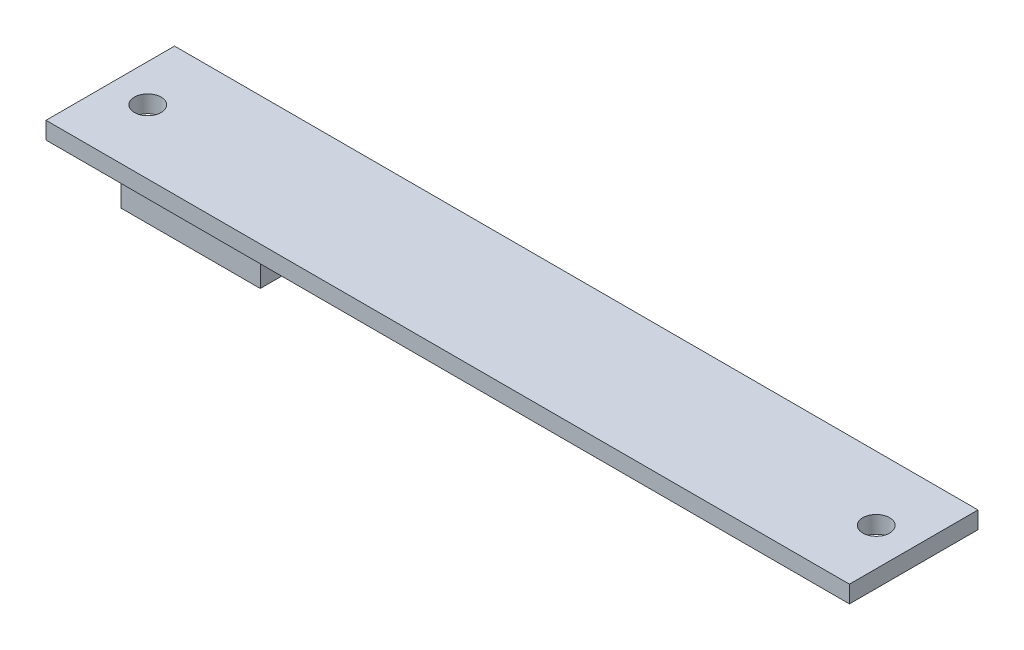
ISO-10303-21;
HEADER;
FILE_DESCRIPTION(('STEP AP214'),'2;1');
FILE_NAME('part.step','',(''),(''),'','','');
FILE_SCHEMA(('AUTOMOTIVE_DESIGN { 1 0 10303 214 1 1 1 1 }'));
ENDSEC;
DATA;
#1=APPLICATION_CONTEXT('core data for automotive mechanical design processes');
#2=APPLICATION_PROTOCOL_DEFINITION('international standard','automotive_design',2000,#1);
#3=PRODUCT_CONTEXT('',#1,'mechanical');
#4=PRODUCT('Part','Part','',(#3));
#5=PRODUCT_RELATED_PRODUCT_CATEGORY('part','',(#4));
#6=PRODUCT_DEFINITION_FORMATION('','',#4);
#7=PRODUCT_DEFINITION_CONTEXT('part definition',#1,'design');
#8=PRODUCT_DEFINITION('design','',#6,#7);
#9=PRODUCT_DEFINITION_SHAPE('','',#8);
#10=(LENGTH_UNIT() NAMED_UNIT(*) SI_UNIT(.MILLI.,.METRE.));
#11=(NAMED_UNIT(*) PLANE_ANGLE_UNIT() SI_UNIT($,.RADIAN.));
#12=(NAMED_UNIT(*) SI_UNIT($,.STERADIAN.) SOLID_ANGLE_UNIT());
#13=UNCERTAINTY_MEASURE_WITH_UNIT(LENGTH_MEASURE(1.E-05),#10,'distance_accuracy_value','');
#14=(GEOMETRIC_REPRESENTATION_CONTEXT(3) GLOBAL_UNCERTAINTY_ASSIGNED_CONTEXT((#13)) GLOBAL_UNIT_ASSIGNED_CONTEXT((#10,
#11,#12)) REPRESENTATION_CONTEXT('',''));
#15=CARTESIAN_POINT('',(0.,0.,0.));
#16=DIRECTION('',(0.,0.,1.));
#17=DIRECTION('',(1.,0.,0.));
#18=AXIS2_PLACEMENT_3D('',#15,#16,#17);
#19=CARTESIAN_POINT('',(0.,0.,0.));
#20=DIRECTION('',(0.,1.,0.));
#21=DIRECTION('',(0.,0.,1.));
#22=AXIS2_PLACEMENT_3D('',#19,#20,#21);
#23=PLANE('',#22);
#24=DIRECTION('',(0.,0.,-1.));
#25=VECTOR('',#24,1.);
#26=CARTESIAN_POINT('',(0.,0.,0.));
#27=LINE('',#26,#25);
#28=CARTESIAN_POINT('',(0.,0.,0.));
#29=VERTEX_POINT('',#28);
#30=CARTESIAN_POINT('',(0.,0.,-12.));
#31=VERTEX_POINT('',#30);
#32=EDGE_CURVE('E142',#29,#31,#27,.T.);
#33=ORIENTED_EDGE('',*,*,#32,.F.);
#34=DIRECTION('',(1.,0.,0.));
#35=VECTOR('',#34,1.);
#36=CARTESIAN_POINT('',(0.,0.,0.));
#37=LINE('',#36,#35);
#38=CARTESIAN_POINT('',(-75.,0.,0.));
#39=VERTEX_POINT('',#38);
#40=EDGE_CURVE('E155',#39,#29,#37,.T.);
#41=ORIENTED_EDGE('',*,*,#40,.F.);
#42=DIRECTION('',(0.,0.,1.));
#43=VECTOR('',#42,1.);
#44=CARTESIAN_POINT('',(-75.,0.,0.));
#45=LINE('',#44,#43);
#46=CARTESIAN_POINT('',(-75.,0.,-12.));
#47=VERTEX_POINT('',#46);
#48=EDGE_CURVE('E162',#47,#39,#45,.T.);
#49=ORIENTED_EDGE('',*,*,#48,.F.);
#50=DIRECTION('',(-1.,0.,0.));
#51=VECTOR('',#50,1.);
#52=CARTESIAN_POINT('',(0.,0.,-12.));
#53=LINE('',#52,#51);
#54=EDGE_CURVE('E161',#31,#47,#53,.T.);
#55=ORIENTED_EDGE('',*,*,#54,.F.);
#56=EDGE_LOOP('',(#33,#41,#49,#55));
#57=FACE_BOUND('',#56,.T.);
#58=CARTESIAN_POINT('',(-3.5,0.,-5.99999999999993));
#59=DIRECTION('',(0.,1.,0.));
#60=DIRECTION('',(0.,0.,1.));
#61=AXIS2_PLACEMENT_3D('',#58,#59,#60);
#62=CIRCLE('',#61,1.25);
#63=CARTESIAN_POINT('',(-3.5,0.,-4.74999999999993));
#64=VERTEX_POINT('',#63);
#65=EDGE_CURVE('E128',#64,#64,#62,.T.);
#66=ORIENTED_EDGE('',*,*,#65,.T.);
#67=EDGE_LOOP('',(#66));
#68=FACE_BOUND('',#67,.T.);
#69=CARTESIAN_POINT('',(-71.5,0.,-5.99999999999993));
#70=DIRECTION('',(0.,1.,0.));
#71=DIRECTION('',(0.,0.,1.));
#72=AXIS2_PLACEMENT_3D('',#69,#70,#71);
#73=CIRCLE('',#72,1.25);
#74=CARTESIAN_POINT('',(-71.5,0.,-4.74999999999993));
#75=VERTEX_POINT('',#74);
#76=EDGE_CURVE('E137',#75,#75,#73,.T.);
#77=ORIENTED_EDGE('',*,*,#76,.T.);
#78=EDGE_LOOP('',(#77));
#79=FACE_BOUND('',#78,.T.);
#80=DIRECTION('',(0.,0.,-1.));
#81=VECTOR('',#80,1.);
#82=CARTESIAN_POINT('',(-69.,0.,-0.99999999999999));
#83=LINE('',#82,#81);
#84=CARTESIAN_POINT('',(-69.,0.,-0.99999999999999));
#85=VERTEX_POINT('',#84);
#86=CARTESIAN_POINT('',(-69.,0.,-3.29999999999988));
#87=VERTEX_POINT('',#86);
#88=EDGE_CURVE('E58',#85,#87,#83,.T.);
#89=ORIENTED_EDGE('',*,*,#88,.F.);
#90=DIRECTION('',(-1.,0.,0.));
#91=VECTOR('',#90,1.);
#92=CARTESIAN_POINT('',(-69.,0.,-0.99999999999999));
#93=LINE('',#92,#91);
#94=CARTESIAN_POINT('',(-56.,0.,-0.99999999999999));
#95=VERTEX_POINT('',#94);
#96=EDGE_CURVE('E63',#95,#85,#93,.T.);
#97=ORIENTED_EDGE('',*,*,#96,.F.);
#98=DIRECTION('',(0.,0.,1.));
#99=VECTOR('',#98,1.);
#100=CARTESIAN_POINT('',(-56.,0.,-0.99999999999999));
#101=LINE('',#100,#99);
#102=CARTESIAN_POINT('',(-56.,0.,-3.29999999999988));
#103=VERTEX_POINT('',#102);
#104=EDGE_CURVE('E335',#103,#95,#101,.T.);
#105=ORIENTED_EDGE('',*,*,#104,.F.);
#106=DIRECTION('',(1.,0.,0.));
#107=VECTOR('',#106,1.);
#108=CARTESIAN_POINT('',(-69.,0.,-3.29999999999988));
#109=LINE('',#108,#107);
#110=EDGE_CURVE('E337',#87,#103,#109,.T.);
#111=ORIENTED_EDGE('',*,*,#110,.F.);
#112=EDGE_LOOP('',(#89,#97,#105,#111));
#113=FACE_BOUND('',#112,.T.);
#114=ADVANCED_FACE('F44',(#57,#68,#79,#113),#23,.F.);
#115=CARTESIAN_POINT('',(0.,1.6,0.));
#116=DIRECTION('',(-1.,0.,0.));
#117=DIRECTION('',(0.,0.,1.));
#118=AXIS2_PLACEMENT_3D('',#115,#116,#117);
#119=PLANE('',#118);
#120=ORIENTED_EDGE('',*,*,#32,.T.);
#121=DIRECTION('',(0.,-1.,0.));
#122=VECTOR('',#121,1.);
#123=CARTESIAN_POINT('',(0.,1.6,-12.));
#124=LINE('',#123,#122);
#125=CARTESIAN_POINT('',(0.,1.6,-12.));
#126=VERTEX_POINT('',#125);
#127=EDGE_CURVE('E11',#126,#31,#124,.T.);
#128=ORIENTED_EDGE('',*,*,#127,.F.);
#129=DIRECTION('',(0.,0.,-1.));
#130=VECTOR('',#129,1.);
#131=CARTESIAN_POINT('',(0.,1.6,0.));
#132=LINE('',#131,#130);
#133=CARTESIAN_POINT('',(0.,1.6,0.));
#134=VERTEX_POINT('',#133);
#135=EDGE_CURVE('E146',#134,#126,#132,.T.);
#136=ORIENTED_EDGE('',*,*,#135,.F.);
#137=DIRECTION('',(0.,-1.,0.));
#138=VECTOR('',#137,1.);
#139=CARTESIAN_POINT('',(0.,1.6,0.));
#140=LINE('',#139,#138);
#141=EDGE_CURVE('E158',#134,#29,#140,.T.);
#142=ORIENTED_EDGE('',*,*,#141,.T.);
#143=EDGE_LOOP('',(#120,#128,#136,#142));
#144=FACE_BOUND('',#143,.T.);
#145=ADVANCED_FACE('F50',(#144),#119,.F.);
#146=CARTESIAN_POINT('',(0.,1.6,-12.));
#147=DIRECTION('',(0.,0.,1.));
#148=DIRECTION('',(1.,0.,0.));
#149=AXIS2_PLACEMENT_3D('',#146,#147,#148);
#150=PLANE('',#149);
#151=ORIENTED_EDGE('',*,*,#54,.T.);
#152=DIRECTION('',(0.,-1.,0.));
#153=VECTOR('',#152,1.);
#154=CARTESIAN_POINT('',(-75.,1.6,-12.));
#155=LINE('',#154,#153);
#156=CARTESIAN_POINT('',(-75.,1.6,-12.));
#157=VERTEX_POINT('',#156);
#158=EDGE_CURVE('E52',#157,#47,#155,.T.);
#159=ORIENTED_EDGE('',*,*,#158,.F.);
#160=DIRECTION('',(-1.,0.,0.));
#161=VECTOR('',#160,1.);
#162=CARTESIAN_POINT('',(0.,1.6,-12.));
#163=LINE('',#162,#161);
#164=EDGE_CURVE('E151',#126,#157,#163,.T.);
#165=ORIENTED_EDGE('',*,*,#164,.F.);
#166=ORIENTED_EDGE('',*,*,#127,.T.);
#167=EDGE_LOOP('',(#151,#159,#165,#166));
#168=FACE_BOUND('',#167,.T.);
#169=ADVANCED_FACE('F193',(#168),#150,.F.);
#170=CARTESIAN_POINT('',(-75.,1.6,0.));
#171=DIRECTION('',(1.,0.,0.));
#172=DIRECTION('',(0.,0.,-1.));
#173=AXIS2_PLACEMENT_3D('',#170,#171,#172);
#174=PLANE('',#173);
#175=ORIENTED_EDGE('',*,*,#48,.T.);
#176=DIRECTION('',(0.,-1.,0.));
#177=VECTOR('',#176,1.);
#178=CARTESIAN_POINT('',(-75.,1.6,0.));
#179=LINE('',#178,#177);
#180=CARTESIAN_POINT('',(-75.,1.6,0.));
#181=VERTEX_POINT('',#180);
#182=EDGE_CURVE('E169',#181,#39,#179,.T.);
#183=ORIENTED_EDGE('',*,*,#182,.F.);
#184=DIRECTION('',(0.,0.,1.));
#185=VECTOR('',#184,1.);
#186=CARTESIAN_POINT('',(-75.,1.6,0.));
#187=LINE('',#186,#185);
#188=EDGE_CURVE('E152',#157,#181,#187,.T.);
#189=ORIENTED_EDGE('',*,*,#188,.F.);
#190=ORIENTED_EDGE('',*,*,#158,.T.);
#191=EDGE_LOOP('',(#175,#183,#189,#190));
#192=FACE_BOUND('',#191,.T.);
#193=ADVANCED_FACE('F174',(#192),#174,.F.);
#194=CARTESIAN_POINT('',(0.,1.6,0.));
#195=DIRECTION('',(0.,0.,-1.));
#196=DIRECTION('',(-1.,0.,0.));
#197=AXIS2_PLACEMENT_3D('',#194,#195,#196);
#198=PLANE('',#197);
#199=ORIENTED_EDGE('',*,*,#40,.T.);
#200=ORIENTED_EDGE('',*,*,#141,.F.);
#201=DIRECTION('',(1.,0.,0.));
#202=VECTOR('',#201,1.);
#203=CARTESIAN_POINT('',(0.,1.6,0.));
#204=LINE('',#203,#202);
#205=EDGE_CURVE('E156',#181,#134,#204,.T.);
#206=ORIENTED_EDGE('',*,*,#205,.F.);
#207=ORIENTED_EDGE('',*,*,#182,.T.);
#208=EDGE_LOOP('',(#199,#200,#206,#207));
#209=FACE_BOUND('',#208,.T.);
#210=ADVANCED_FACE('F184',(#209),#198,.F.);
#211=CARTESIAN_POINT('',(0.,1.6,0.));
#212=DIRECTION('',(0.,1.,0.));
#213=DIRECTION('',(0.,0.,1.));
#214=AXIS2_PLACEMENT_3D('',#211,#212,#213);
#215=PLANE('',#214);
#216=CARTESIAN_POINT('',(-71.5,1.6,-5.99999999999993));
#217=DIRECTION('',(0.,1.,0.));
#218=DIRECTION('',(0.,0.,1.));
#219=AXIS2_PLACEMENT_3D('',#216,#217,#218);
#220=CIRCLE('',#219,1.25);
#221=CARTESIAN_POINT('',(-71.5,1.6,-4.74999999999993));
#222=VERTEX_POINT('',#221);
#223=EDGE_CURVE('E141',#222,#222,#220,.T.);
#224=ORIENTED_EDGE('',*,*,#223,.F.);
#225=EDGE_LOOP('',(#224));
#226=FACE_BOUND('',#225,.T.);
#227=CARTESIAN_POINT('',(-3.5,1.6,-5.99999999999993));
#228=DIRECTION('',(0.,1.,0.));
#229=DIRECTION('',(0.,0.,1.));
#230=AXIS2_PLACEMENT_3D('',#227,#228,#229);
#231=CIRCLE('',#230,1.25);
#232=CARTESIAN_POINT('',(-3.5,1.6,-4.74999999999993));
#233=VERTEX_POINT('',#232);
#234=EDGE_CURVE('E132',#233,#233,#231,.T.);
#235=ORIENTED_EDGE('',*,*,#234,.F.);
#236=EDGE_LOOP('',(#235));
#237=FACE_BOUND('',#236,.T.);
#238=ORIENTED_EDGE('',*,*,#135,.T.);
#239=ORIENTED_EDGE('',*,*,#164,.T.);
#240=ORIENTED_EDGE('',*,*,#188,.T.);
#241=ORIENTED_EDGE('',*,*,#205,.T.);
#242=EDGE_LOOP('',(#238,#239,#240,#241));
#243=FACE_BOUND('',#242,.T.);
#244=ADVANCED_FACE('F189',(#226,#237,#243),#215,.T.);
#245=CARTESIAN_POINT('',(-3.5,0.,-5.99999999999993));
#246=DIRECTION('',(0.,1.,0.));
#247=DIRECTION('',(0.,0.,1.));
#248=AXIS2_PLACEMENT_3D('',#245,#246,#247);
#249=CYLINDRICAL_SURFACE('',#248,1.25);
#250=ORIENTED_EDGE('',*,*,#65,.F.);
#251=EDGE_LOOP('',(#250));
#252=FACE_BOUND('',#251,.T.);
#253=ORIENTED_EDGE('',*,*,#234,.T.);
#254=EDGE_LOOP('',(#253));
#255=FACE_BOUND('',#254,.T.);
#256=ADVANCED_FACE('F211',(#252,#255),#249,.F.);
#257=CARTESIAN_POINT('',(-71.5,0.,-5.99999999999993));
#258=DIRECTION('',(0.,1.,0.));
#259=DIRECTION('',(0.,0.,1.));
#260=AXIS2_PLACEMENT_3D('',#257,#258,#259);
#261=CYLINDRICAL_SURFACE('',#260,1.25);
#262=ORIENTED_EDGE('',*,*,#76,.F.);
#263=EDGE_LOOP('',(#262));
#264=FACE_BOUND('',#263,.T.);
#265=ORIENTED_EDGE('',*,*,#223,.T.);
#266=EDGE_LOOP('',(#265));
#267=FACE_BOUND('',#266,.T.);
#268=ADVANCED_FACE('F216',(#264,#267),#261,.F.);
#269=CARTESIAN_POINT('',(-69.,-3.,-0.99999999999999));
#270=DIRECTION('',(1.,0.,0.));
#271=DIRECTION('',(0.,0.,-1.));
#272=AXIS2_PLACEMENT_3D('',#269,#270,#271);
#273=PLANE('',#272);
#274=ORIENTED_EDGE('',*,*,#88,.T.);
#275=DIRECTION('',(0.,1.,0.));
#276=VECTOR('',#275,1.);
#277=CARTESIAN_POINT('',(-69.,-3.,-3.29999999999988));
#278=LINE('',#277,#276);
#279=CARTESIAN_POINT('',(-69.,-3.,-3.29999999999988));
#280=VERTEX_POINT('',#279);
#281=EDGE_CURVE('E114',#280,#87,#278,.T.);
#282=ORIENTED_EDGE('',*,*,#281,.F.);
#283=DIRECTION('',(0.,0.,-1.));
#284=VECTOR('',#283,1.);
#285=CARTESIAN_POINT('',(-69.,-3.,-0.99999999999999));
#286=LINE('',#285,#284);
#287=CARTESIAN_POINT('',(-69.,-3.,-0.99999999999999));
#288=VERTEX_POINT('',#287);
#289=EDGE_CURVE('E118',#288,#280,#286,.T.);
#290=ORIENTED_EDGE('',*,*,#289,.F.);
#291=DIRECTION('',(0.,1.,0.));
#292=VECTOR('',#291,1.);
#293=CARTESIAN_POINT('',(-69.,-3.,-0.99999999999999));
#294=LINE('',#293,#292);
#295=EDGE_CURVE('E329',#288,#85,#294,.T.);
#296=ORIENTED_EDGE('',*,*,#295,.T.);
#297=EDGE_LOOP('',(#274,#282,#290,#296));
#298=FACE_BOUND('',#297,.T.);
#299=ADVANCED_FACE('F129',(#298),#273,.F.);
#300=CARTESIAN_POINT('',(-69.,-3.,-3.29999999999988));
#301=DIRECTION('',(0.,0.,1.));
#302=DIRECTION('',(1.,0.,0.));
#303=AXIS2_PLACEMENT_3D('',#300,#301,#302);
#304=PLANE('',#303);
#305=ORIENTED_EDGE('',*,*,#110,.T.);
#306=DIRECTION('',(0.,1.,0.));
#307=VECTOR('',#306,1.);
#308=CARTESIAN_POINT('',(-56.,-3.,-3.29999999999988));
#309=LINE('',#308,#307);
#310=CARTESIAN_POINT('',(-56.,-3.,-3.29999999999988));
#311=VERTEX_POINT('',#310);
#312=EDGE_CURVE('E113',#311,#103,#309,.T.);
#313=ORIENTED_EDGE('',*,*,#312,.F.);
#314=DIRECTION('',(1.,0.,0.));
#315=VECTOR('',#314,1.);
#316=CARTESIAN_POINT('',(-69.,-3.,-3.29999999999988));
#317=LINE('',#316,#315);
#318=EDGE_CURVE('E107',#280,#311,#317,.T.);
#319=ORIENTED_EDGE('',*,*,#318,.F.);
#320=ORIENTED_EDGE('',*,*,#281,.T.);
#321=EDGE_LOOP('',(#305,#313,#319,#320));
#322=FACE_BOUND('',#321,.T.);
#323=ADVANCED_FACE('F112',(#322),#304,.F.);
#324=CARTESIAN_POINT('',(-56.,-3.,-0.99999999999999));
#325=DIRECTION('',(-1.,0.,0.));
#326=DIRECTION('',(0.,0.,1.));
#327=AXIS2_PLACEMENT_3D('',#324,#325,#326);
#328=PLANE('',#327);
#329=ORIENTED_EDGE('',*,*,#104,.T.);
#330=DIRECTION('',(0.,1.,0.));
#331=VECTOR('',#330,1.);
#332=CARTESIAN_POINT('',(-56.,-3.,-0.99999999999999));
#333=LINE('',#332,#331);
#334=CARTESIAN_POINT('',(-56.,-3.,-0.99999999999999));
#335=VERTEX_POINT('',#334);
#336=EDGE_CURVE('E134',#335,#95,#333,.T.);
#337=ORIENTED_EDGE('',*,*,#336,.F.);
#338=DIRECTION('',(0.,0.,1.));
#339=VECTOR('',#338,1.);
#340=CARTESIAN_POINT('',(-56.,-3.,-0.99999999999999));
#341=LINE('',#340,#339);
#342=EDGE_CURVE('E117',#311,#335,#341,.T.);
#343=ORIENTED_EDGE('',*,*,#342,.F.);
#344=ORIENTED_EDGE('',*,*,#312,.T.);
#345=EDGE_LOOP('',(#329,#337,#343,#344));
#346=FACE_BOUND('',#345,.T.);
#347=ADVANCED_FACE('F231',(#346),#328,.F.);
#348=CARTESIAN_POINT('',(-69.,-3.,-0.99999999999999));
#349=DIRECTION('',(0.,0.,-1.));
#350=DIRECTION('',(-1.,0.,0.));
#351=AXIS2_PLACEMENT_3D('',#348,#349,#350);
#352=PLANE('',#351);
#353=ORIENTED_EDGE('',*,*,#96,.T.);
#354=ORIENTED_EDGE('',*,*,#295,.F.);
#355=DIRECTION('',(-1.,0.,0.));
#356=VECTOR('',#355,1.);
#357=CARTESIAN_POINT('',(-69.,-3.,-0.99999999999999));
#358=LINE('',#357,#356);
#359=EDGE_CURVE('E122',#335,#288,#358,.T.);
#360=ORIENTED_EDGE('',*,*,#359,.F.);
#361=ORIENTED_EDGE('',*,*,#336,.T.);
#362=EDGE_LOOP('',(#353,#354,#360,#361));
#363=FACE_BOUND('',#362,.T.);
#364=ADVANCED_FACE('F237',(#363),#352,.F.);
#365=CARTESIAN_POINT('',(0.,-3.,0.));
#366=DIRECTION('',(0.,-1.,0.));
#367=DIRECTION('',(0.,0.,-1.));
#368=AXIS2_PLACEMENT_3D('',#365,#366,#367);
#369=PLANE('',#368);
#370=ORIENTED_EDGE('',*,*,#289,.T.);
#371=ORIENTED_EDGE('',*,*,#318,.T.);
#372=ORIENTED_EDGE('',*,*,#342,.T.);
#373=ORIENTED_EDGE('',*,*,#359,.T.);
#374=EDGE_LOOP('',(#370,#371,#372,#373));
#375=FACE_BOUND('',#374,.T.);
#376=ADVANCED_FACE('F125',(#375),#369,.T.);
#377=CLOSED_SHELL('',(#114,#145,#169,#193,#210,#244,#256,#268,#299,#323,#347,#364,#376));
#378=MANIFOLD_SOLID_BREP('B2',#377);
#379=ADVANCED_BREP_SHAPE_REPRESENTATION('',(#18,#378),#14);
#380=SHAPE_DEFINITION_REPRESENTATION(#9,#379);
ENDSEC;
END-ISO-10303-21;
